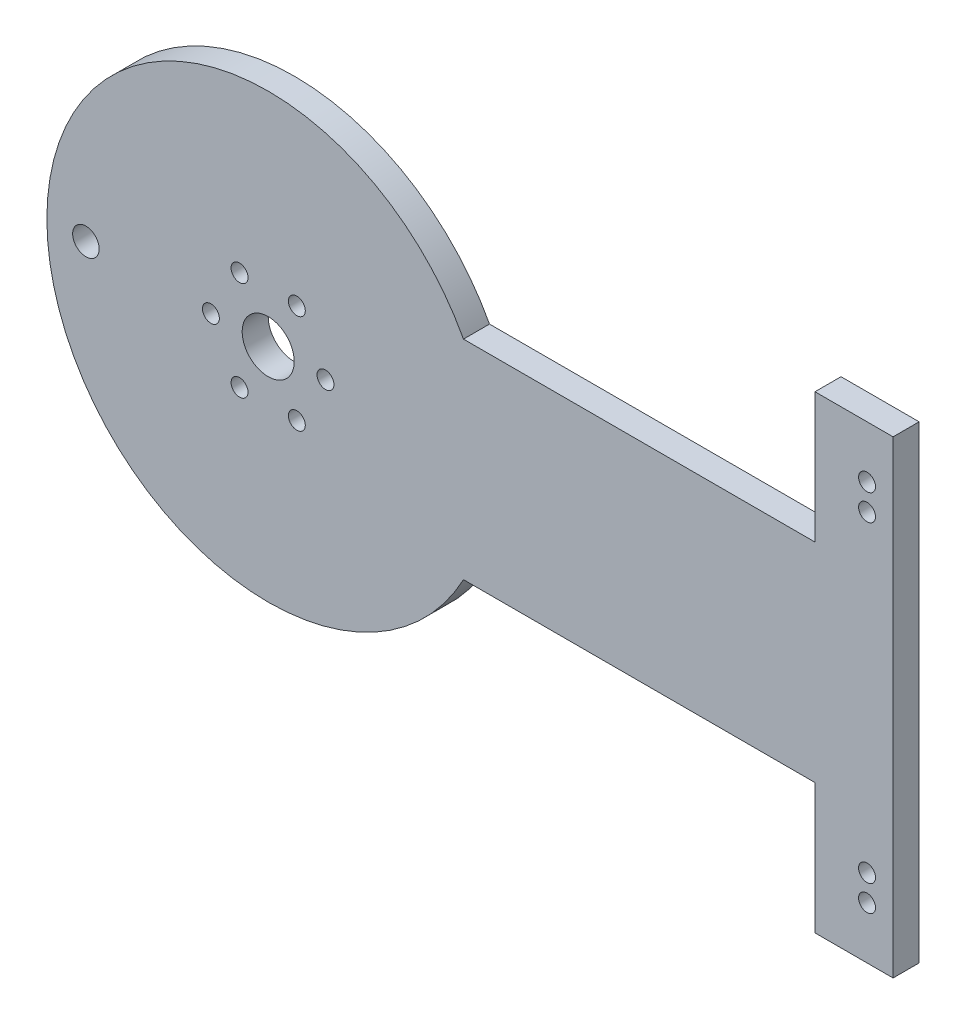
ISO-10303-21;
HEADER;
FILE_DESCRIPTION(('STEP AP214'),'2;1');
FILE_NAME('part.step','',(''),(''),'','','');
FILE_SCHEMA(('AUTOMOTIVE_DESIGN { 1 0 10303 214 1 1 1 1 }'));
ENDSEC;
DATA;
#1=APPLICATION_CONTEXT('core data for automotive mechanical design processes');
#2=APPLICATION_PROTOCOL_DEFINITION('international standard','automotive_design',2000,#1);
#3=PRODUCT_CONTEXT('',#1,'mechanical');
#4=PRODUCT('Part','Part','',(#3));
#5=PRODUCT_RELATED_PRODUCT_CATEGORY('part','',(#4));
#6=PRODUCT_DEFINITION_FORMATION('','',#4);
#7=PRODUCT_DEFINITION_CONTEXT('part definition',#1,'design');
#8=PRODUCT_DEFINITION('design','',#6,#7);
#9=PRODUCT_DEFINITION_SHAPE('','',#8);
#10=(LENGTH_UNIT() NAMED_UNIT(*) SI_UNIT(.MILLI.,.METRE.));
#11=(NAMED_UNIT(*) PLANE_ANGLE_UNIT() SI_UNIT($,.RADIAN.));
#12=(NAMED_UNIT(*) SI_UNIT($,.STERADIAN.) SOLID_ANGLE_UNIT());
#13=UNCERTAINTY_MEASURE_WITH_UNIT(LENGTH_MEASURE(1.E-05),#10,'distance_accuracy_value','');
#14=(GEOMETRIC_REPRESENTATION_CONTEXT(3) GLOBAL_UNCERTAINTY_ASSIGNED_CONTEXT((#13)) GLOBAL_UNIT_ASSIGNED_CONTEXT((#10,
#11,#12)) REPRESENTATION_CONTEXT('',''));
#15=CARTESIAN_POINT('',(0.,0.,0.));
#16=DIRECTION('',(0.,0.,1.));
#17=DIRECTION('',(1.,0.,0.));
#18=AXIS2_PLACEMENT_3D('',#15,#16,#17);
#19=CARTESIAN_POINT('',(0.,-40.,10.));
#20=DIRECTION('',(0.,1.,0.));
#21=DIRECTION('',(0.,0.,1.));
#22=AXIS2_PLACEMENT_3D('',#19,#20,#21);
#23=PLANE('',#22);
#24=DIRECTION('',(0.,0.,-1.));
#25=VECTOR('',#24,1.);
#26=CARTESIAN_POINT('',(210.,-40.,10.));
#27=LINE('',#26,#25);
#28=CARTESIAN_POINT('',(210.,-40.,10.));
#29=VERTEX_POINT('',#28);
#30=CARTESIAN_POINT('',(210.,-40.,0.));
#31=VERTEX_POINT('',#30);
#32=EDGE_CURVE('E67',#29,#31,#27,.T.);
#33=ORIENTED_EDGE('',*,*,#32,.F.);
#34=DIRECTION('',(1.,0.,0.));
#35=VECTOR('',#34,1.);
#36=CARTESIAN_POINT('',(0.,-40.,10.));
#37=LINE('',#36,#35);
#38=CARTESIAN_POINT('',(75.,-40.,10.));
#39=VERTEX_POINT('',#38);
#40=EDGE_CURVE('E120',#39,#29,#37,.T.);
#41=ORIENTED_EDGE('',*,*,#40,.F.);
#42=DIRECTION('',(0.,0.,-1.));
#43=VECTOR('',#42,1.);
#44=CARTESIAN_POINT('',(75.,-40.,10.));
#45=LINE('',#44,#43);
#46=CARTESIAN_POINT('',(75.,-40.,0.));
#47=VERTEX_POINT('',#46);
#48=EDGE_CURVE('E170',#39,#47,#45,.T.);
#49=ORIENTED_EDGE('',*,*,#48,.T.);
#50=DIRECTION('',(1.,0.,0.));
#51=VECTOR('',#50,1.);
#52=CARTESIAN_POINT('',(0.,-40.,0.));
#53=LINE('',#52,#51);
#54=EDGE_CURVE('E63',#47,#31,#53,.T.);
#55=ORIENTED_EDGE('',*,*,#54,.T.);
#56=EDGE_LOOP('',(#33,#41,#49,#55));
#57=FACE_BOUND('',#56,.T.);
#58=ADVANCED_FACE('F47',(#57),#23,.F.);
#59=CARTESIAN_POINT('',(240.,40.,10.));
#60=DIRECTION('',(0.,-1.,0.));
#61=DIRECTION('',(0.,0.,-1.));
#62=AXIS2_PLACEMENT_3D('',#59,#60,#61);
#63=PLANE('',#62);
#64=DIRECTION('',(0.,0.,1.));
#65=VECTOR('',#64,1.);
#66=CARTESIAN_POINT('',(210.,40.,10.));
#67=LINE('',#66,#65);
#68=CARTESIAN_POINT('',(210.,40.,0.));
#69=VERTEX_POINT('',#68);
#70=CARTESIAN_POINT('',(210.,40.,10.));
#71=VERTEX_POINT('',#70);
#72=EDGE_CURVE('E11',#69,#71,#67,.T.);
#73=ORIENTED_EDGE('',*,*,#72,.F.);
#74=DIRECTION('',(-1.,0.,0.));
#75=VECTOR('',#74,1.);
#76=CARTESIAN_POINT('',(240.,40.,0.));
#77=LINE('',#76,#75);
#78=CARTESIAN_POINT('',(75.,40.,0.));
#79=VERTEX_POINT('',#78);
#80=EDGE_CURVE('E153',#69,#79,#77,.T.);
#81=ORIENTED_EDGE('',*,*,#80,.T.);
#82=DIRECTION('',(0.,0.,-1.));
#83=VECTOR('',#82,1.);
#84=CARTESIAN_POINT('',(75.,40.,10.));
#85=LINE('',#84,#83);
#86=CARTESIAN_POINT('',(75.,40.,10.));
#87=VERTEX_POINT('',#86);
#88=EDGE_CURVE('E159',#79,#87,#85,.F.);
#89=ORIENTED_EDGE('',*,*,#88,.T.);
#90=DIRECTION('',(-1.,0.,0.));
#91=VECTOR('',#90,1.);
#92=CARTESIAN_POINT('',(240.,40.,10.));
#93=LINE('',#92,#91);
#94=EDGE_CURVE('E156',#71,#87,#93,.T.);
#95=ORIENTED_EDGE('',*,*,#94,.F.);
#96=EDGE_LOOP('',(#73,#81,#89,#95));
#97=FACE_BOUND('',#96,.T.);
#98=ADVANCED_FACE('F338',(#97),#63,.F.);
#99=CARTESIAN_POINT('',(0.,0.,10.));
#100=DIRECTION('',(0.,0.,-1.));
#101=DIRECTION('',(-1.,0.,0.));
#102=AXIS2_PLACEMENT_3D('',#99,#100,#101);
#103=CYLINDRICAL_SURFACE('',#102,85.);
#104=ORIENTED_EDGE('',*,*,#48,.F.);
#105=CARTESIAN_POINT('',(0.,0.,10.));
#106=DIRECTION('',(0.,0.,1.));
#107=DIRECTION('',(1.,0.,0.));
#108=AXIS2_PLACEMENT_3D('',#105,#106,#107);
#109=CIRCLE('',#108,85.);
#110=EDGE_CURVE('E56',#87,#39,#109,.T.);
#111=ORIENTED_EDGE('',*,*,#110,.F.);
#112=ORIENTED_EDGE('',*,*,#88,.F.);
#113=CARTESIAN_POINT('',(0.,0.,0.));
#114=DIRECTION('',(0.,0.,1.));
#115=DIRECTION('',(1.,0.,0.));
#116=AXIS2_PLACEMENT_3D('',#113,#114,#115);
#117=CIRCLE('',#116,85.);
#118=EDGE_CURVE('E173',#79,#47,#117,.T.);
#119=ORIENTED_EDGE('',*,*,#118,.T.);
#120=EDGE_LOOP('',(#104,#111,#112,#119));
#121=FACE_BOUND('',#120,.T.);
#122=ADVANCED_FACE('F49',(#121),#103,.T.);
#123=CARTESIAN_POINT('',(0.,0.,10.));
#124=DIRECTION('',(0.,0.,1.));
#125=DIRECTION('',(1.,0.,0.));
#126=AXIS2_PLACEMENT_3D('',#123,#124,#125);
#127=PLANE('',#126);
#128=CARTESIAN_POINT('',(22.,0.,10.));
#129=DIRECTION('',(0.,0.,1.));
#130=DIRECTION('',(1.,0.,0.));
#131=AXIS2_PLACEMENT_3D('',#128,#129,#130);
#132=CIRCLE('',#131,3.25);
#133=CARTESIAN_POINT('',(25.25,0.,10.));
#134=VERTEX_POINT('',#133);
#135=EDGE_CURVE('E185',#134,#134,#132,.T.);
#136=ORIENTED_EDGE('',*,*,#135,.F.);
#137=EDGE_LOOP('',(#136));
#138=FACE_BOUND('',#137,.T.);
#139=CARTESIAN_POINT('',(11.,19.0525588832576,10.));
#140=DIRECTION('',(0.,0.,1.));
#141=DIRECTION('',(1.,0.,0.));
#142=AXIS2_PLACEMENT_3D('',#139,#140,#141);
#143=CIRCLE('',#142,3.25);
#144=CARTESIAN_POINT('',(14.25,19.0525588832576,10.));
#145=VERTEX_POINT('',#144);
#146=EDGE_CURVE('E191',#145,#145,#143,.T.);
#147=ORIENTED_EDGE('',*,*,#146,.F.);
#148=EDGE_LOOP('',(#147));
#149=FACE_BOUND('',#148,.T.);
#150=CARTESIAN_POINT('',(-11.,19.0525588832577,10.));
#151=DIRECTION('',(0.,0.,1.));
#152=DIRECTION('',(1.,0.,0.));
#153=AXIS2_PLACEMENT_3D('',#150,#151,#152);
#154=CIRCLE('',#153,3.25);
#155=CARTESIAN_POINT('',(-7.74999999999999,19.0525588832577,10.));
#156=VERTEX_POINT('',#155);
#157=EDGE_CURVE('E221',#156,#156,#154,.T.);
#158=ORIENTED_EDGE('',*,*,#157,.F.);
#159=EDGE_LOOP('',(#158));
#160=FACE_BOUND('',#159,.T.);
#161=CARTESIAN_POINT('',(-22.,0.,10.));
#162=DIRECTION('',(0.,0.,1.));
#163=DIRECTION('',(1.,0.,0.));
#164=AXIS2_PLACEMENT_3D('',#161,#162,#163);
#165=CIRCLE('',#164,3.25);
#166=CARTESIAN_POINT('',(-18.75,0.,10.));
#167=VERTEX_POINT('',#166);
#168=EDGE_CURVE('E225',#167,#167,#165,.T.);
#169=ORIENTED_EDGE('',*,*,#168,.F.);
#170=EDGE_LOOP('',(#169));
#171=FACE_BOUND('',#170,.T.);
#172=CARTESIAN_POINT('',(-11.,-19.0525588832576,10.));
#173=DIRECTION('',(0.,0.,1.));
#174=DIRECTION('',(1.,0.,0.));
#175=AXIS2_PLACEMENT_3D('',#172,#173,#174);
#176=CIRCLE('',#175,3.25);
#177=CARTESIAN_POINT('',(-7.75000000000001,-19.0525588832576,10.));
#178=VERTEX_POINT('',#177);
#179=EDGE_CURVE('E229',#178,#178,#176,.T.);
#180=ORIENTED_EDGE('',*,*,#179,.F.);
#181=EDGE_LOOP('',(#180));
#182=FACE_BOUND('',#181,.T.);
#183=CARTESIAN_POINT('',(11.,-19.0525588832576,10.));
#184=DIRECTION('',(0.,0.,1.));
#185=DIRECTION('',(1.,0.,0.));
#186=AXIS2_PLACEMENT_3D('',#183,#184,#185);
#187=CIRCLE('',#186,3.25);
#188=CARTESIAN_POINT('',(14.25,-19.0525588832576,10.));
#189=VERTEX_POINT('',#188);
#190=EDGE_CURVE('E233',#189,#189,#187,.T.);
#191=ORIENTED_EDGE('',*,*,#190,.F.);
#192=EDGE_LOOP('',(#191));
#193=FACE_BOUND('',#192,.T.);
#194=CARTESIAN_POINT('',(230.,-70.,10.));
#195=DIRECTION('',(0.,0.,1.));
#196=DIRECTION('',(1.,0.,0.));
#197=AXIS2_PLACEMENT_3D('',#194,#195,#196);
#198=CIRCLE('',#197,3.25);
#199=CARTESIAN_POINT('',(233.25,-70.,10.));
#200=VERTEX_POINT('',#199);
#201=EDGE_CURVE('E237',#200,#200,#198,.T.);
#202=ORIENTED_EDGE('',*,*,#201,.F.);
#203=EDGE_LOOP('',(#202));
#204=FACE_BOUND('',#203,.T.);
#205=CARTESIAN_POINT('',(230.,-60.,10.));
#206=DIRECTION('',(0.,0.,1.));
#207=DIRECTION('',(1.,0.,0.));
#208=AXIS2_PLACEMENT_3D('',#205,#206,#207);
#209=CIRCLE('',#208,3.25);
#210=CARTESIAN_POINT('',(233.25,-60.,10.));
#211=VERTEX_POINT('',#210);
#212=EDGE_CURVE('E241',#211,#211,#209,.T.);
#213=ORIENTED_EDGE('',*,*,#212,.F.);
#214=EDGE_LOOP('',(#213));
#215=FACE_BOUND('',#214,.T.);
#216=CARTESIAN_POINT('',(230.,60.,10.));
#217=DIRECTION('',(0.,0.,1.));
#218=DIRECTION('',(1.,0.,0.));
#219=AXIS2_PLACEMENT_3D('',#216,#217,#218);
#220=CIRCLE('',#219,3.25);
#221=CARTESIAN_POINT('',(233.25,60.,10.));
#222=VERTEX_POINT('',#221);
#223=EDGE_CURVE('E245',#222,#222,#220,.T.);
#224=ORIENTED_EDGE('',*,*,#223,.F.);
#225=EDGE_LOOP('',(#224));
#226=FACE_BOUND('',#225,.T.);
#227=CARTESIAN_POINT('',(230.,70.,10.));
#228=DIRECTION('',(0.,0.,1.));
#229=DIRECTION('',(1.,0.,0.));
#230=AXIS2_PLACEMENT_3D('',#227,#228,#229);
#231=CIRCLE('',#230,3.25);
#232=CARTESIAN_POINT('',(233.25,70.,10.));
#233=VERTEX_POINT('',#232);
#234=EDGE_CURVE('E249',#233,#233,#231,.T.);
#235=ORIENTED_EDGE('',*,*,#234,.F.);
#236=EDGE_LOOP('',(#235));
#237=FACE_BOUND('',#236,.T.);
#238=CARTESIAN_POINT('',(-70.,0.,10.));
#239=DIRECTION('',(0.,0.,1.));
#240=DIRECTION('',(1.,0.,0.));
#241=AXIS2_PLACEMENT_3D('',#238,#239,#240);
#242=CIRCLE('',#241,5.09999999999999);
#243=CARTESIAN_POINT('',(-64.9,0.,10.));
#244=VERTEX_POINT('',#243);
#245=EDGE_CURVE('E253',#244,#244,#242,.T.);
#246=ORIENTED_EDGE('',*,*,#245,.F.);
#247=EDGE_LOOP('',(#246));
#248=FACE_BOUND('',#247,.T.);
#249=CARTESIAN_POINT('',(0.,0.,10.));
#250=DIRECTION('',(0.,0.,1.));
#251=DIRECTION('',(1.,0.,0.));
#252=AXIS2_PLACEMENT_3D('',#249,#250,#251);
#253=CIRCLE('',#252,10.);
#254=CARTESIAN_POINT('',(10.,0.,10.));
#255=VERTEX_POINT('',#254);
#256=EDGE_CURVE('E257',#255,#255,#253,.T.);
#257=ORIENTED_EDGE('',*,*,#256,.F.);
#258=EDGE_LOOP('',(#257));
#259=FACE_BOUND('',#258,.T.);
#260=DIRECTION('',(0.,-1.,0.));
#261=VECTOR('',#260,1.);
#262=CARTESIAN_POINT('',(210.,90.,10.));
#263=LINE('',#262,#261);
#264=CARTESIAN_POINT('',(210.,90.,10.));
#265=VERTEX_POINT('',#264);
#266=EDGE_CURVE('E124',#265,#71,#263,.T.);
#267=ORIENTED_EDGE('',*,*,#266,.T.);
#268=ORIENTED_EDGE('',*,*,#94,.T.);
#269=ORIENTED_EDGE('',*,*,#110,.T.);
#270=ORIENTED_EDGE('',*,*,#40,.T.);
#271=CARTESIAN_POINT('',(210.,-90.,10.));
#272=VERTEX_POINT('',#271);
#273=EDGE_CURVE('E113',#29,#272,#263,.T.);
#274=ORIENTED_EDGE('',*,*,#273,.T.);
#275=DIRECTION('',(1.,0.,0.));
#276=VECTOR('',#275,1.);
#277=CARTESIAN_POINT('',(210.,-90.,10.));
#278=LINE('',#277,#276);
#279=CARTESIAN_POINT('',(240.,-90.,10.));
#280=VERTEX_POINT('',#279);
#281=EDGE_CURVE('E117',#272,#280,#278,.T.);
#282=ORIENTED_EDGE('',*,*,#281,.T.);
#283=DIRECTION('',(0.,1.,0.));
#284=VECTOR('',#283,1.);
#285=CARTESIAN_POINT('',(240.,-40.,10.));
#286=LINE('',#285,#284);
#287=CARTESIAN_POINT('',(240.,90.,10.));
#288=VERTEX_POINT('',#287);
#289=EDGE_CURVE('E152',#280,#288,#286,.T.);
#290=ORIENTED_EDGE('',*,*,#289,.T.);
#291=DIRECTION('',(-1.,0.,0.));
#292=VECTOR('',#291,1.);
#293=CARTESIAN_POINT('',(240.,90.,10.));
#294=LINE('',#293,#292);
#295=EDGE_CURVE('E135',#288,#265,#294,.T.);
#296=ORIENTED_EDGE('',*,*,#295,.T.);
#297=EDGE_LOOP('',(#267,#268,#269,#270,#274,#282,#290,#296));
#298=FACE_BOUND('',#297,.T.);
#299=ADVANCED_FACE('F116',(#138,#149,#160,#171,#182,#193,#204,#215,#226,#237,#248,#259,#298),
#127,.T.);
#300=CARTESIAN_POINT('',(0.,0.,0.));
#301=DIRECTION('',(0.,0.,1.));
#302=DIRECTION('',(1.,0.,0.));
#303=AXIS2_PLACEMENT_3D('',#300,#301,#302);
#304=PLANE('',#303);
#305=CARTESIAN_POINT('',(22.,0.,0.));
#306=DIRECTION('',(0.,0.,-1.));
#307=DIRECTION('',(-1.,0.,0.));
#308=AXIS2_PLACEMENT_3D('',#305,#306,#307);
#309=CIRCLE('',#308,3.25);
#310=CARTESIAN_POINT('',(18.75,0.,0.));
#311=VERTEX_POINT('',#310);
#312=EDGE_CURVE('E265',#311,#311,#309,.T.);
#313=ORIENTED_EDGE('',*,*,#312,.F.);
#314=EDGE_LOOP('',(#313));
#315=FACE_BOUND('',#314,.T.);
#316=CARTESIAN_POINT('',(11.,19.0525588832576,0.));
#317=DIRECTION('',(0.,0.,-1.));
#318=DIRECTION('',(-1.,0.,0.));
#319=AXIS2_PLACEMENT_3D('',#316,#317,#318);
#320=CIRCLE('',#319,3.25);
#321=CARTESIAN_POINT('',(7.75,19.0525588832576,0.));
#322=VERTEX_POINT('',#321);
#323=EDGE_CURVE('E291',#322,#322,#320,.T.);
#324=ORIENTED_EDGE('',*,*,#323,.F.);
#325=EDGE_LOOP('',(#324));
#326=FACE_BOUND('',#325,.T.);
#327=CARTESIAN_POINT('',(-11.,19.0525588832577,0.));
#328=DIRECTION('',(0.,0.,-1.));
#329=DIRECTION('',(-1.,0.,0.));
#330=AXIS2_PLACEMENT_3D('',#327,#328,#329);
#331=CIRCLE('',#330,3.25);
#332=CARTESIAN_POINT('',(-14.25,19.0525588832577,0.));
#333=VERTEX_POINT('',#332);
#334=EDGE_CURVE('E287',#333,#333,#331,.T.);
#335=ORIENTED_EDGE('',*,*,#334,.F.);
#336=EDGE_LOOP('',(#335));
#337=FACE_BOUND('',#336,.T.);
#338=CARTESIAN_POINT('',(-22.,0.,0.));
#339=DIRECTION('',(0.,0.,-1.));
#340=DIRECTION('',(-1.,0.,0.));
#341=AXIS2_PLACEMENT_3D('',#338,#339,#340);
#342=CIRCLE('',#341,3.25);
#343=CARTESIAN_POINT('',(-25.25,0.,0.));
#344=VERTEX_POINT('',#343);
#345=EDGE_CURVE('E283',#344,#344,#342,.T.);
#346=ORIENTED_EDGE('',*,*,#345,.F.);
#347=EDGE_LOOP('',(#346));
#348=FACE_BOUND('',#347,.T.);
#349=CARTESIAN_POINT('',(-11.,-19.0525588832576,0.));
#350=DIRECTION('',(0.,0.,-1.));
#351=DIRECTION('',(-1.,0.,0.));
#352=AXIS2_PLACEMENT_3D('',#349,#350,#351);
#353=CIRCLE('',#352,3.25);
#354=CARTESIAN_POINT('',(-14.25,-19.0525588832576,0.));
#355=VERTEX_POINT('',#354);
#356=EDGE_CURVE('E279',#355,#355,#353,.T.);
#357=ORIENTED_EDGE('',*,*,#356,.F.);
#358=EDGE_LOOP('',(#357));
#359=FACE_BOUND('',#358,.T.);
#360=CARTESIAN_POINT('',(11.,-19.0525588832576,0.));
#361=DIRECTION('',(0.,0.,-1.));
#362=DIRECTION('',(-1.,0.,0.));
#363=AXIS2_PLACEMENT_3D('',#360,#361,#362);
#364=CIRCLE('',#363,3.25);
#365=CARTESIAN_POINT('',(7.75,-19.0525588832576,0.));
#366=VERTEX_POINT('',#365);
#367=EDGE_CURVE('E275',#366,#366,#364,.T.);
#368=ORIENTED_EDGE('',*,*,#367,.F.);
#369=EDGE_LOOP('',(#368));
#370=FACE_BOUND('',#369,.T.);
#371=CARTESIAN_POINT('',(230.,-70.,0.));
#372=DIRECTION('',(0.,0.,-1.));
#373=DIRECTION('',(-1.,0.,0.));
#374=AXIS2_PLACEMENT_3D('',#371,#372,#373);
#375=CIRCLE('',#374,3.25);
#376=CARTESIAN_POINT('',(226.75,-70.,0.));
#377=VERTEX_POINT('',#376);
#378=EDGE_CURVE('E270',#377,#377,#375,.T.);
#379=ORIENTED_EDGE('',*,*,#378,.F.);
#380=EDGE_LOOP('',(#379));
#381=FACE_BOUND('',#380,.T.);
#382=CARTESIAN_POINT('',(230.,-60.,0.));
#383=DIRECTION('',(0.,0.,-1.));
#384=DIRECTION('',(-1.,0.,0.));
#385=AXIS2_PLACEMENT_3D('',#382,#383,#384);
#386=CIRCLE('',#385,3.25);
#387=CARTESIAN_POINT('',(226.75,-60.,0.));
#388=VERTEX_POINT('',#387);
#389=EDGE_CURVE('E266',#388,#388,#386,.T.);
#390=ORIENTED_EDGE('',*,*,#389,.F.);
#391=EDGE_LOOP('',(#390));
#392=FACE_BOUND('',#391,.T.);
#393=CARTESIAN_POINT('',(230.,60.,0.));
#394=DIRECTION('',(0.,0.,-1.));
#395=DIRECTION('',(-1.,0.,0.));
#396=AXIS2_PLACEMENT_3D('',#393,#394,#395);
#397=CIRCLE('',#396,3.25);
#398=CARTESIAN_POINT('',(226.75,60.,0.));
#399=VERTEX_POINT('',#398);
#400=EDGE_CURVE('E271',#399,#399,#397,.T.);
#401=ORIENTED_EDGE('',*,*,#400,.F.);
#402=EDGE_LOOP('',(#401));
#403=FACE_BOUND('',#402,.T.);
#404=CARTESIAN_POINT('',(230.,70.,0.));
#405=DIRECTION('',(0.,0.,-1.));
#406=DIRECTION('',(-1.,0.,0.));
#407=AXIS2_PLACEMENT_3D('',#404,#405,#406);
#408=CIRCLE('',#407,3.25);
#409=CARTESIAN_POINT('',(226.75,70.,0.));
#410=VERTEX_POINT('',#409);
#411=EDGE_CURVE('E302',#410,#410,#408,.T.);
#412=ORIENTED_EDGE('',*,*,#411,.F.);
#413=EDGE_LOOP('',(#412));
#414=FACE_BOUND('',#413,.T.);
#415=CARTESIAN_POINT('',(-70.,0.,0.));
#416=DIRECTION('',(0.,0.,-1.));
#417=DIRECTION('',(-1.,0.,0.));
#418=AXIS2_PLACEMENT_3D('',#415,#416,#417);
#419=CIRCLE('',#418,5.09999999999999);
#420=CARTESIAN_POINT('',(-75.1,0.,0.));
#421=VERTEX_POINT('',#420);
#422=EDGE_CURVE('E298',#421,#421,#419,.T.);
#423=ORIENTED_EDGE('',*,*,#422,.F.);
#424=EDGE_LOOP('',(#423));
#425=FACE_BOUND('',#424,.T.);
#426=CARTESIAN_POINT('',(0.,0.,0.));
#427=DIRECTION('',(0.,0.,-1.));
#428=DIRECTION('',(-1.,0.,0.));
#429=AXIS2_PLACEMENT_3D('',#426,#427,#428);
#430=CIRCLE('',#429,10.);
#431=CARTESIAN_POINT('',(-10.,0.,0.));
#432=VERTEX_POINT('',#431);
#433=EDGE_CURVE('E261',#432,#432,#430,.T.);
#434=ORIENTED_EDGE('',*,*,#433,.F.);
#435=EDGE_LOOP('',(#434));
#436=FACE_BOUND('',#435,.T.);
#437=DIRECTION('',(0.,1.,0.));
#438=VECTOR('',#437,1.);
#439=CARTESIAN_POINT('',(240.,-40.,0.));
#440=LINE('',#439,#438);
#441=CARTESIAN_POINT('',(240.,-90.,0.));
#442=VERTEX_POINT('',#441);
#443=CARTESIAN_POINT('',(240.,90.,0.));
#444=VERTEX_POINT('',#443);
#445=EDGE_CURVE('E162',#442,#444,#440,.T.);
#446=ORIENTED_EDGE('',*,*,#445,.F.);
#447=DIRECTION('',(1.,0.,0.));
#448=VECTOR('',#447,1.);
#449=CARTESIAN_POINT('',(210.,-90.,0.));
#450=LINE('',#449,#448);
#451=CARTESIAN_POINT('',(210.,-90.,0.));
#452=VERTEX_POINT('',#451);
#453=EDGE_CURVE('E182',#452,#442,#450,.T.);
#454=ORIENTED_EDGE('',*,*,#453,.F.);
#455=DIRECTION('',(0.,-1.,0.));
#456=VECTOR('',#455,1.);
#457=CARTESIAN_POINT('',(210.,90.,0.));
#458=LINE('',#457,#456);
#459=EDGE_CURVE('E139',#31,#452,#458,.T.);
#460=ORIENTED_EDGE('',*,*,#459,.F.);
#461=ORIENTED_EDGE('',*,*,#54,.F.);
#462=ORIENTED_EDGE('',*,*,#118,.F.);
#463=ORIENTED_EDGE('',*,*,#80,.F.);
#464=CARTESIAN_POINT('',(210.,90.,0.));
#465=VERTEX_POINT('',#464);
#466=EDGE_CURVE('E184',#465,#69,#458,.T.);
#467=ORIENTED_EDGE('',*,*,#466,.F.);
#468=DIRECTION('',(-1.,0.,0.));
#469=VECTOR('',#468,1.);
#470=CARTESIAN_POINT('',(240.,90.,0.));
#471=LINE('',#470,#469);
#472=EDGE_CURVE('E125',#444,#465,#471,.T.);
#473=ORIENTED_EDGE('',*,*,#472,.F.);
#474=EDGE_LOOP('',(#446,#454,#460,#461,#462,#463,#467,#473));
#475=FACE_BOUND('',#474,.T.);
#476=ADVANCED_FACE('F181',(#315,#326,#337,#348,#359,#370,#381,#392,#403,#414,#425,#436,#475),
#304,.F.);
#477=CARTESIAN_POINT('',(240.,-40.,10.));
#478=DIRECTION('',(-1.,0.,0.));
#479=DIRECTION('',(0.,0.,1.));
#480=AXIS2_PLACEMENT_3D('',#477,#478,#479);
#481=PLANE('',#480);
#482=ORIENTED_EDGE('',*,*,#445,.T.);
#483=DIRECTION('',(0.,0.,-1.));
#484=VECTOR('',#483,1.);
#485=CARTESIAN_POINT('',(240.,90.,10.));
#486=LINE('',#485,#484);
#487=EDGE_CURVE('E146',#288,#444,#486,.T.);
#488=ORIENTED_EDGE('',*,*,#487,.F.);
#489=ORIENTED_EDGE('',*,*,#289,.F.);
#490=DIRECTION('',(0.,0.,-1.));
#491=VECTOR('',#490,1.);
#492=CARTESIAN_POINT('',(240.,-90.,10.));
#493=LINE('',#492,#491);
#494=EDGE_CURVE('E133',#280,#442,#493,.T.);
#495=ORIENTED_EDGE('',*,*,#494,.T.);
#496=EDGE_LOOP('',(#482,#488,#489,#495));
#497=FACE_BOUND('',#496,.T.);
#498=ADVANCED_FACE('F314',(#497),#481,.F.);
#499=CARTESIAN_POINT('',(240.,90.,10.));
#500=DIRECTION('',(0.,-1.,0.));
#501=DIRECTION('',(0.,0.,-1.));
#502=AXIS2_PLACEMENT_3D('',#499,#500,#501);
#503=PLANE('',#502);
#504=ORIENTED_EDGE('',*,*,#472,.T.);
#505=DIRECTION('',(0.,0.,-1.));
#506=VECTOR('',#505,1.);
#507=CARTESIAN_POINT('',(210.,90.,10.));
#508=LINE('',#507,#506);
#509=EDGE_CURVE('E199',#265,#465,#508,.T.);
#510=ORIENTED_EDGE('',*,*,#509,.F.);
#511=ORIENTED_EDGE('',*,*,#295,.F.);
#512=ORIENTED_EDGE('',*,*,#487,.T.);
#513=EDGE_LOOP('',(#504,#510,#511,#512));
#514=FACE_BOUND('',#513,.T.);
#515=ADVANCED_FACE('F208',(#514),#503,.F.);
#516=CARTESIAN_POINT('',(210.,90.,10.));
#517=DIRECTION('',(1.,0.,0.));
#518=DIRECTION('',(0.,0.,-1.));
#519=AXIS2_PLACEMENT_3D('',#516,#517,#518);
#520=PLANE('',#519);
#521=ORIENTED_EDGE('',*,*,#466,.T.);
#522=ORIENTED_EDGE('',*,*,#72,.T.);
#523=ORIENTED_EDGE('',*,*,#266,.F.);
#524=ORIENTED_EDGE('',*,*,#509,.T.);
#525=EDGE_LOOP('',(#521,#522,#523,#524));
#526=FACE_BOUND('',#525,.T.);
#527=ADVANCED_FACE('F214',(#526),#520,.F.);
#528=ORIENTED_EDGE('',*,*,#273,.F.);
#529=ORIENTED_EDGE('',*,*,#32,.T.);
#530=ORIENTED_EDGE('',*,*,#459,.T.);
#531=DIRECTION('',(0.,0.,-1.));
#532=VECTOR('',#531,1.);
#533=CARTESIAN_POINT('',(210.,-90.,10.));
#534=LINE('',#533,#532);
#535=EDGE_CURVE('E131',#272,#452,#534,.T.);
#536=ORIENTED_EDGE('',*,*,#535,.F.);
#537=EDGE_LOOP('',(#528,#529,#530,#536));
#538=FACE_BOUND('',#537,.T.);
#539=ADVANCED_FACE('F137',(#538),#520,.F.);
#540=CARTESIAN_POINT('',(210.,-90.,10.));
#541=DIRECTION('',(0.,1.,0.));
#542=DIRECTION('',(0.,0.,1.));
#543=AXIS2_PLACEMENT_3D('',#540,#541,#542);
#544=PLANE('',#543);
#545=ORIENTED_EDGE('',*,*,#453,.T.);
#546=ORIENTED_EDGE('',*,*,#494,.F.);
#547=ORIENTED_EDGE('',*,*,#281,.F.);
#548=ORIENTED_EDGE('',*,*,#535,.T.);
#549=EDGE_LOOP('',(#545,#546,#547,#548));
#550=FACE_BOUND('',#549,.T.);
#551=ADVANCED_FACE('F130',(#550),#544,.F.);
#552=CARTESIAN_POINT('',(0.,0.,11.));
#553=DIRECTION('',(0.,0.,-1.));
#554=DIRECTION('',(-1.,0.,0.));
#555=AXIS2_PLACEMENT_3D('',#552,#553,#554);
#556=CYLINDRICAL_SURFACE('',#555,10.);
#557=ORIENTED_EDGE('',*,*,#256,.T.);
#558=EDGE_LOOP('',(#557));
#559=FACE_BOUND('',#558,.T.);
#560=ORIENTED_EDGE('',*,*,#433,.T.);
#561=EDGE_LOOP('',(#560));
#562=FACE_BOUND('',#561,.T.);
#563=ADVANCED_FACE('F322',(#559,#562),#556,.F.);
#564=CARTESIAN_POINT('',(-70.,0.,11.));
#565=DIRECTION('',(0.,0.,-1.));
#566=DIRECTION('',(-1.,0.,0.));
#567=AXIS2_PLACEMENT_3D('',#564,#565,#566);
#568=CYLINDRICAL_SURFACE('',#567,5.09999999999999);
#569=ORIENTED_EDGE('',*,*,#245,.T.);
#570=EDGE_LOOP('',(#569));
#571=FACE_BOUND('',#570,.T.);
#572=ORIENTED_EDGE('',*,*,#422,.T.);
#573=EDGE_LOOP('',(#572));
#574=FACE_BOUND('',#573,.T.);
#575=ADVANCED_FACE('F324',(#571,#574),#568,.F.);
#576=CARTESIAN_POINT('',(230.,70.,11.));
#577=DIRECTION('',(0.,0.,-1.));
#578=DIRECTION('',(-1.,0.,0.));
#579=AXIS2_PLACEMENT_3D('',#576,#577,#578);
#580=CYLINDRICAL_SURFACE('',#579,3.25);
#581=ORIENTED_EDGE('',*,*,#234,.T.);
#582=EDGE_LOOP('',(#581));
#583=FACE_BOUND('',#582,.T.);
#584=ORIENTED_EDGE('',*,*,#411,.T.);
#585=EDGE_LOOP('',(#584));
#586=FACE_BOUND('',#585,.T.);
#587=ADVANCED_FACE('F330',(#583,#586),#580,.F.);
#588=CARTESIAN_POINT('',(230.,60.,11.));
#589=DIRECTION('',(0.,0.,-1.));
#590=DIRECTION('',(-1.,0.,0.));
#591=AXIS2_PLACEMENT_3D('',#588,#589,#590);
#592=CYLINDRICAL_SURFACE('',#591,3.25);
#593=ORIENTED_EDGE('',*,*,#223,.T.);
#594=EDGE_LOOP('',(#593));
#595=FACE_BOUND('',#594,.T.);
#596=ORIENTED_EDGE('',*,*,#400,.T.);
#597=EDGE_LOOP('',(#596));
#598=FACE_BOUND('',#597,.T.);
#599=ADVANCED_FACE('F310',(#595,#598),#592,.F.);
#600=CARTESIAN_POINT('',(230.,-60.,11.));
#601=DIRECTION('',(0.,0.,-1.));
#602=DIRECTION('',(-1.,0.,0.));
#603=AXIS2_PLACEMENT_3D('',#600,#601,#602);
#604=CYLINDRICAL_SURFACE('',#603,3.25);
#605=ORIENTED_EDGE('',*,*,#212,.T.);
#606=EDGE_LOOP('',(#605));
#607=FACE_BOUND('',#606,.T.);
#608=ORIENTED_EDGE('',*,*,#389,.T.);
#609=EDGE_LOOP('',(#608));
#610=FACE_BOUND('',#609,.T.);
#611=ADVANCED_FACE('F383',(#607,#610),#604,.F.);
#612=CARTESIAN_POINT('',(230.,-70.,11.));
#613=DIRECTION('',(0.,0.,-1.));
#614=DIRECTION('',(-1.,0.,0.));
#615=AXIS2_PLACEMENT_3D('',#612,#613,#614);
#616=CYLINDRICAL_SURFACE('',#615,3.25);
#617=ORIENTED_EDGE('',*,*,#201,.T.);
#618=EDGE_LOOP('',(#617));
#619=FACE_BOUND('',#618,.T.);
#620=ORIENTED_EDGE('',*,*,#378,.T.);
#621=EDGE_LOOP('',(#620));
#622=FACE_BOUND('',#621,.T.);
#623=ADVANCED_FACE('F410',(#619,#622),#616,.F.);
#624=CARTESIAN_POINT('',(11.,-19.0525588832576,11.));
#625=DIRECTION('',(0.,0.,-1.));
#626=DIRECTION('',(-1.,0.,0.));
#627=AXIS2_PLACEMENT_3D('',#624,#625,#626);
#628=CYLINDRICAL_SURFACE('',#627,3.25);
#629=ORIENTED_EDGE('',*,*,#190,.T.);
#630=EDGE_LOOP('',(#629));
#631=FACE_BOUND('',#630,.T.);
#632=ORIENTED_EDGE('',*,*,#367,.T.);
#633=EDGE_LOOP('',(#632));
#634=FACE_BOUND('',#633,.T.);
#635=ADVANCED_FACE('F406',(#631,#634),#628,.F.);
#636=CARTESIAN_POINT('',(-11.,-19.0525588832576,11.));
#637=DIRECTION('',(0.,0.,-1.));
#638=DIRECTION('',(-1.,0.,0.));
#639=AXIS2_PLACEMENT_3D('',#636,#637,#638);
#640=CYLINDRICAL_SURFACE('',#639,3.25);
#641=ORIENTED_EDGE('',*,*,#179,.T.);
#642=EDGE_LOOP('',(#641));
#643=FACE_BOUND('',#642,.T.);
#644=ORIENTED_EDGE('',*,*,#356,.T.);
#645=EDGE_LOOP('',(#644));
#646=FACE_BOUND('',#645,.T.);
#647=ADVANCED_FACE('F402',(#643,#646),#640,.F.);
#648=CARTESIAN_POINT('',(-22.,0.,11.));
#649=DIRECTION('',(0.,0.,-1.));
#650=DIRECTION('',(-1.,0.,0.));
#651=AXIS2_PLACEMENT_3D('',#648,#649,#650);
#652=CYLINDRICAL_SURFACE('',#651,3.25);
#653=ORIENTED_EDGE('',*,*,#168,.T.);
#654=EDGE_LOOP('',(#653));
#655=FACE_BOUND('',#654,.T.);
#656=ORIENTED_EDGE('',*,*,#345,.T.);
#657=EDGE_LOOP('',(#656));
#658=FACE_BOUND('',#657,.T.);
#659=ADVANCED_FACE('F398',(#655,#658),#652,.F.);
#660=CARTESIAN_POINT('',(-11.,19.0525588832577,11.));
#661=DIRECTION('',(0.,0.,-1.));
#662=DIRECTION('',(-1.,0.,0.));
#663=AXIS2_PLACEMENT_3D('',#660,#661,#662);
#664=CYLINDRICAL_SURFACE('',#663,3.25);
#665=ORIENTED_EDGE('',*,*,#157,.T.);
#666=EDGE_LOOP('',(#665));
#667=FACE_BOUND('',#666,.T.);
#668=ORIENTED_EDGE('',*,*,#334,.T.);
#669=EDGE_LOOP('',(#668));
#670=FACE_BOUND('',#669,.T.);
#671=ADVANCED_FACE('F394',(#667,#670),#664,.F.);
#672=CARTESIAN_POINT('',(11.,19.0525588832576,11.));
#673=DIRECTION('',(0.,0.,-1.));
#674=DIRECTION('',(-1.,0.,0.));
#675=AXIS2_PLACEMENT_3D('',#672,#673,#674);
#676=CYLINDRICAL_SURFACE('',#675,3.25);
#677=ORIENTED_EDGE('',*,*,#146,.T.);
#678=EDGE_LOOP('',(#677));
#679=FACE_BOUND('',#678,.T.);
#680=ORIENTED_EDGE('',*,*,#323,.T.);
#681=EDGE_LOOP('',(#680));
#682=FACE_BOUND('',#681,.T.);
#683=ADVANCED_FACE('F390',(#679,#682),#676,.F.);
#684=CARTESIAN_POINT('',(22.,0.,11.));
#685=DIRECTION('',(0.,0.,-1.));
#686=DIRECTION('',(-1.,0.,0.));
#687=AXIS2_PLACEMENT_3D('',#684,#685,#686);
#688=CYLINDRICAL_SURFACE('',#687,3.25);
#689=ORIENTED_EDGE('',*,*,#135,.T.);
#690=EDGE_LOOP('',(#689));
#691=FACE_BOUND('',#690,.T.);
#692=ORIENTED_EDGE('',*,*,#312,.T.);
#693=EDGE_LOOP('',(#692));
#694=FACE_BOUND('',#693,.T.);
#695=ADVANCED_FACE('F387',(#691,#694),#688,.F.);
#696=CLOSED_SHELL('',(#58,#98,#122,#299,#476,#498,#515,#527,#539,#551,#563,#575,#587,#599,#611,
#623,#635,#647,#659,#671,#683,#695));
#697=MANIFOLD_SOLID_BREP('B2',#696);
#698=ADVANCED_BREP_SHAPE_REPRESENTATION('',(#18,#697),#14);
#699=SHAPE_DEFINITION_REPRESENTATION(#9,#698);
ENDSEC;
END-ISO-10303-21;
